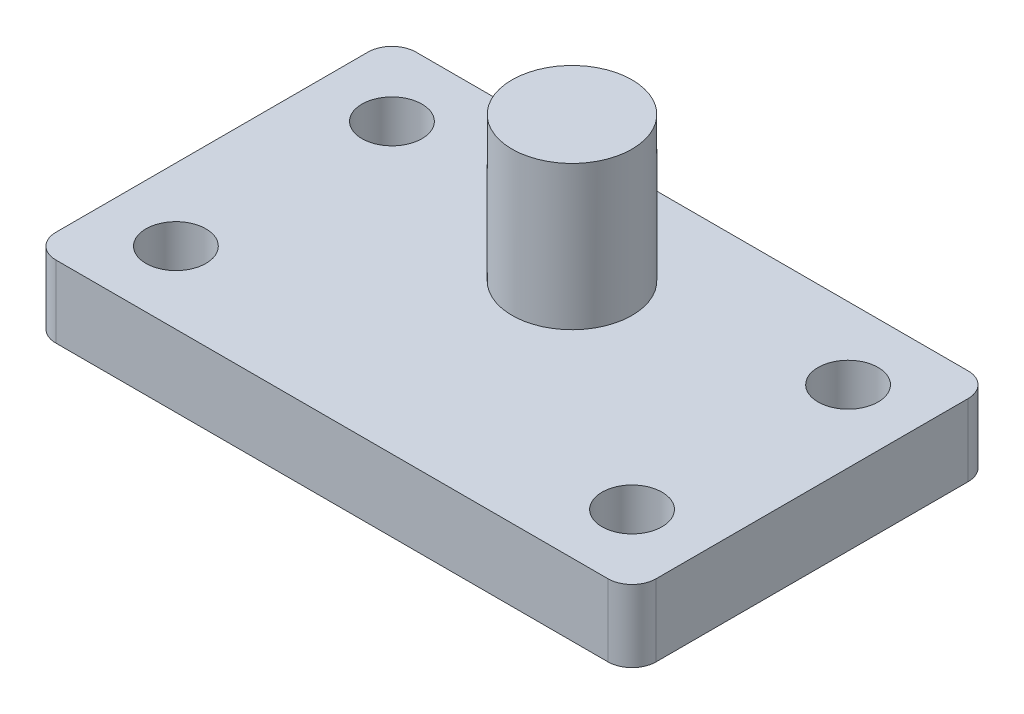
ISO-10303-21;
HEADER;
FILE_DESCRIPTION(('STEP AP214'),'2;1');
FILE_NAME('part.step','',(''),(''),'','','');
FILE_SCHEMA(('AUTOMOTIVE_DESIGN { 1 0 10303 214 1 1 1 1 }'));
ENDSEC;
DATA;
#1=APPLICATION_CONTEXT('core data for automotive mechanical design processes');
#2=APPLICATION_PROTOCOL_DEFINITION('international standard','automotive_design',2000,#1);
#3=PRODUCT_CONTEXT('',#1,'mechanical');
#4=PRODUCT('Part','Part','',(#3));
#5=PRODUCT_RELATED_PRODUCT_CATEGORY('part','',(#4));
#6=PRODUCT_DEFINITION_FORMATION('','',#4);
#7=PRODUCT_DEFINITION_CONTEXT('part definition',#1,'design');
#8=PRODUCT_DEFINITION('design','',#6,#7);
#9=PRODUCT_DEFINITION_SHAPE('','',#8);
#10=(LENGTH_UNIT() NAMED_UNIT(*) SI_UNIT(.MILLI.,.METRE.));
#11=(NAMED_UNIT(*) PLANE_ANGLE_UNIT() SI_UNIT($,.RADIAN.));
#12=(NAMED_UNIT(*) SI_UNIT($,.STERADIAN.) SOLID_ANGLE_UNIT());
#13=UNCERTAINTY_MEASURE_WITH_UNIT(LENGTH_MEASURE(1.E-05),#10,'distance_accuracy_value','');
#14=(GEOMETRIC_REPRESENTATION_CONTEXT(3) GLOBAL_UNCERTAINTY_ASSIGNED_CONTEXT((#13)) GLOBAL_UNIT_ASSIGNED_CONTEXT((#10,
#11,#12)) REPRESENTATION_CONTEXT('',''));
#15=CARTESIAN_POINT('',(0.,0.,0.));
#16=DIRECTION('',(0.,0.,1.));
#17=DIRECTION('',(1.,0.,0.));
#18=AXIS2_PLACEMENT_3D('',#15,#16,#17);
#19=CARTESIAN_POINT('',(115.,-30.,-65.));
#20=DIRECTION('',(0.,1.,0.));
#21=DIRECTION('',(0.,0.,1.));
#22=AXIS2_PLACEMENT_3D('',#19,#20,#21);
#23=CYLINDRICAL_SURFACE('',#22,9.99999999999999);
#24=CARTESIAN_POINT('',(115.,0.,-65.));
#25=DIRECTION('',(0.,1.,0.));
#26=DIRECTION('',(0.,0.,-1.));
#27=AXIS2_PLACEMENT_3D('',#24,#25,#26);
#28=CIRCLE('',#27,9.99999999999999);
#29=CARTESIAN_POINT('',(125.,0.,-65.));
#30=VERTEX_POINT('',#29);
#31=CARTESIAN_POINT('',(115.,0.,-75.));
#32=VERTEX_POINT('',#31);
#33=EDGE_CURVE('E149',#30,#32,#28,.T.);
#34=ORIENTED_EDGE('',*,*,#33,.F.);
#35=DIRECTION('',(0.,1.,0.));
#36=VECTOR('',#35,1.);
#37=CARTESIAN_POINT('',(125.,-30.,-65.));
#38=LINE('',#37,#36);
#39=CARTESIAN_POINT('',(125.,-30.,-65.));
#40=VERTEX_POINT('',#39);
#41=EDGE_CURVE('E54',#40,#30,#38,.T.);
#42=ORIENTED_EDGE('',*,*,#41,.F.);
#43=CARTESIAN_POINT('',(115.,-30.,-65.));
#44=DIRECTION('',(0.,1.,0.));
#45=DIRECTION('',(0.,0.,-1.));
#46=AXIS2_PLACEMENT_3D('',#43,#44,#45);
#47=CIRCLE('',#46,9.99999999999999);
#48=CARTESIAN_POINT('',(115.,-30.,-75.));
#49=VERTEX_POINT('',#48);
#50=EDGE_CURVE('E179',#40,#49,#47,.T.);
#51=ORIENTED_EDGE('',*,*,#50,.T.);
#52=DIRECTION('',(0.,1.,0.));
#53=VECTOR('',#52,1.);
#54=CARTESIAN_POINT('',(115.,-30.,-75.));
#55=LINE('',#54,#53);
#56=EDGE_CURVE('E102',#49,#32,#55,.T.);
#57=ORIENTED_EDGE('',*,*,#56,.T.);
#58=EDGE_LOOP('',(#34,#42,#51,#57));
#59=FACE_BOUND('',#58,.T.);
#60=ADVANCED_FACE('F45',(#59),#23,.T.);
#61=CARTESIAN_POINT('',(125.,-30.,-65.));
#62=DIRECTION('',(1.,0.,0.));
#63=DIRECTION('',(0.,0.,-1.));
#64=AXIS2_PLACEMENT_3D('',#61,#62,#63);
#65=PLANE('',#64);
#66=DIRECTION('',(0.,0.,-1.));
#67=VECTOR('',#66,1.);
#68=CARTESIAN_POINT('',(125.,0.,-65.));
#69=LINE('',#68,#67);
#70=CARTESIAN_POINT('',(125.,0.,65.));
#71=VERTEX_POINT('',#70);
#72=EDGE_CURVE('E175',#71,#30,#69,.T.);
#73=ORIENTED_EDGE('',*,*,#72,.F.);
#74=DIRECTION('',(0.,1.,0.));
#75=VECTOR('',#74,1.);
#76=CARTESIAN_POINT('',(125.,-30.,65.));
#77=LINE('',#76,#75);
#78=CARTESIAN_POINT('',(125.,-30.,65.));
#79=VERTEX_POINT('',#78);
#80=EDGE_CURVE('E90',#79,#71,#77,.T.);
#81=ORIENTED_EDGE('',*,*,#80,.F.);
#82=DIRECTION('',(0.,0.,-1.));
#83=VECTOR('',#82,1.);
#84=CARTESIAN_POINT('',(125.,-30.,-65.));
#85=LINE('',#84,#83);
#86=EDGE_CURVE('E135',#79,#40,#85,.T.);
#87=ORIENTED_EDGE('',*,*,#86,.T.);
#88=ORIENTED_EDGE('',*,*,#41,.T.);
#89=EDGE_LOOP('',(#73,#81,#87,#88));
#90=FACE_BOUND('',#89,.T.);
#91=ADVANCED_FACE('F199',(#90),#65,.T.);
#92=CARTESIAN_POINT('',(115.,-30.,65.));
#93=DIRECTION('',(0.,1.,0.));
#94=DIRECTION('',(0.,0.,1.));
#95=AXIS2_PLACEMENT_3D('',#92,#93,#94);
#96=CYLINDRICAL_SURFACE('',#95,9.99999999999999);
#97=CARTESIAN_POINT('',(115.,0.,65.));
#98=DIRECTION('',(0.,1.,0.));
#99=DIRECTION('',(0.,0.,1.));
#100=AXIS2_PLACEMENT_3D('',#97,#98,#99);
#101=CIRCLE('',#100,9.99999999999999);
#102=CARTESIAN_POINT('',(115.,0.,75.));
#103=VERTEX_POINT('',#102);
#104=EDGE_CURVE('E121',#103,#71,#101,.T.);
#105=ORIENTED_EDGE('',*,*,#104,.F.);
#106=DIRECTION('',(0.,1.,0.));
#107=VECTOR('',#106,1.);
#108=CARTESIAN_POINT('',(115.,-30.,75.));
#109=LINE('',#108,#107);
#110=CARTESIAN_POINT('',(115.,-30.,75.));
#111=VERTEX_POINT('',#110);
#112=EDGE_CURVE('E116',#111,#103,#109,.T.);
#113=ORIENTED_EDGE('',*,*,#112,.F.);
#114=CARTESIAN_POINT('',(115.,-30.,65.));
#115=DIRECTION('',(0.,1.,0.));
#116=DIRECTION('',(0.,0.,1.));
#117=AXIS2_PLACEMENT_3D('',#114,#115,#116);
#118=CIRCLE('',#117,9.99999999999999);
#119=EDGE_CURVE('E119',#111,#79,#118,.T.);
#120=ORIENTED_EDGE('',*,*,#119,.T.);
#121=ORIENTED_EDGE('',*,*,#80,.T.);
#122=EDGE_LOOP('',(#105,#113,#120,#121));
#123=FACE_BOUND('',#122,.T.);
#124=ADVANCED_FACE('F118',(#123),#96,.T.);
#125=CARTESIAN_POINT('',(-115.,-30.,75.));
#126=DIRECTION('',(0.,0.,1.));
#127=DIRECTION('',(1.,0.,0.));
#128=AXIS2_PLACEMENT_3D('',#125,#126,#127);
#129=PLANE('',#128);
#130=DIRECTION('',(1.,0.,0.));
#131=VECTOR('',#130,1.);
#132=CARTESIAN_POINT('',(-115.,0.,75.));
#133=LINE('',#132,#131);
#134=CARTESIAN_POINT('',(-115.,0.,75.));
#135=VERTEX_POINT('',#134);
#136=EDGE_CURVE('E170',#135,#103,#133,.T.);
#137=ORIENTED_EDGE('',*,*,#136,.F.);
#138=DIRECTION('',(0.,1.,0.));
#139=VECTOR('',#138,1.);
#140=CARTESIAN_POINT('',(-115.,-30.,75.));
#141=LINE('',#140,#139);
#142=CARTESIAN_POINT('',(-115.,-30.,75.));
#143=VERTEX_POINT('',#142);
#144=EDGE_CURVE('E127',#143,#135,#141,.T.);
#145=ORIENTED_EDGE('',*,*,#144,.F.);
#146=DIRECTION('',(1.,0.,0.));
#147=VECTOR('',#146,1.);
#148=CARTESIAN_POINT('',(-115.,-30.,75.));
#149=LINE('',#148,#147);
#150=EDGE_CURVE('E133',#143,#111,#149,.T.);
#151=ORIENTED_EDGE('',*,*,#150,.T.);
#152=ORIENTED_EDGE('',*,*,#112,.T.);
#153=EDGE_LOOP('',(#137,#145,#151,#152));
#154=FACE_BOUND('',#153,.T.);
#155=ADVANCED_FACE('F138',(#154),#129,.T.);
#156=CARTESIAN_POINT('',(-115.,-30.,65.));
#157=DIRECTION('',(0.,1.,0.));
#158=DIRECTION('',(0.,0.,1.));
#159=AXIS2_PLACEMENT_3D('',#156,#157,#158);
#160=CYLINDRICAL_SURFACE('',#159,10.);
#161=CARTESIAN_POINT('',(-115.,0.,65.));
#162=DIRECTION('',(0.,1.,0.));
#163=DIRECTION('',(0.,0.,1.));
#164=AXIS2_PLACEMENT_3D('',#161,#162,#163);
#165=CIRCLE('',#164,10.);
#166=CARTESIAN_POINT('',(-125.,0.,65.));
#167=VERTEX_POINT('',#166);
#168=EDGE_CURVE('E166',#167,#135,#165,.T.);
#169=ORIENTED_EDGE('',*,*,#168,.F.);
#170=DIRECTION('',(0.,1.,0.));
#171=VECTOR('',#170,1.);
#172=CARTESIAN_POINT('',(-125.,-30.,65.));
#173=LINE('',#172,#171);
#174=CARTESIAN_POINT('',(-125.,-30.,65.));
#175=VERTEX_POINT('',#174);
#176=EDGE_CURVE('E186',#175,#167,#173,.T.);
#177=ORIENTED_EDGE('',*,*,#176,.F.);
#178=CARTESIAN_POINT('',(-115.,-30.,65.));
#179=DIRECTION('',(0.,1.,0.));
#180=DIRECTION('',(0.,0.,1.));
#181=AXIS2_PLACEMENT_3D('',#178,#179,#180);
#182=CIRCLE('',#181,10.);
#183=EDGE_CURVE('E140',#175,#143,#182,.T.);
#184=ORIENTED_EDGE('',*,*,#183,.T.);
#185=ORIENTED_EDGE('',*,*,#144,.T.);
#186=EDGE_LOOP('',(#169,#177,#184,#185));
#187=FACE_BOUND('',#186,.T.);
#188=ADVANCED_FACE('F212',(#187),#160,.T.);
#189=CARTESIAN_POINT('',(-125.,-30.,-65.));
#190=DIRECTION('',(-1.,0.,0.));
#191=DIRECTION('',(0.,0.,1.));
#192=AXIS2_PLACEMENT_3D('',#189,#190,#191);
#193=PLANE('',#192);
#194=DIRECTION('',(0.,0.,1.));
#195=VECTOR('',#194,1.);
#196=CARTESIAN_POINT('',(-125.,0.,-65.));
#197=LINE('',#196,#195);
#198=CARTESIAN_POINT('',(-125.,0.,-65.));
#199=VERTEX_POINT('',#198);
#200=EDGE_CURVE('E162',#199,#167,#197,.T.);
#201=ORIENTED_EDGE('',*,*,#200,.F.);
#202=DIRECTION('',(0.,1.,0.));
#203=VECTOR('',#202,1.);
#204=CARTESIAN_POINT('',(-125.,-30.,-65.));
#205=LINE('',#204,#203);
#206=CARTESIAN_POINT('',(-125.,-30.,-65.));
#207=VERTEX_POINT('',#206);
#208=EDGE_CURVE('E189',#207,#199,#205,.T.);
#209=ORIENTED_EDGE('',*,*,#208,.F.);
#210=DIRECTION('',(0.,0.,1.));
#211=VECTOR('',#210,1.);
#212=CARTESIAN_POINT('',(-125.,-30.,-65.));
#213=LINE('',#212,#211);
#214=EDGE_CURVE('E143',#207,#175,#213,.T.);
#215=ORIENTED_EDGE('',*,*,#214,.T.);
#216=ORIENTED_EDGE('',*,*,#176,.T.);
#217=EDGE_LOOP('',(#201,#209,#215,#216));
#218=FACE_BOUND('',#217,.T.);
#219=ADVANCED_FACE('F215',(#218),#193,.T.);
#220=CARTESIAN_POINT('',(-115.,-30.,-65.));
#221=DIRECTION('',(0.,1.,0.));
#222=DIRECTION('',(0.,0.,1.));
#223=AXIS2_PLACEMENT_3D('',#220,#221,#222);
#224=CYLINDRICAL_SURFACE('',#223,9.99999999999999);
#225=CARTESIAN_POINT('',(-115.,0.,-65.));
#226=DIRECTION('',(0.,1.,0.));
#227=DIRECTION('',(0.,0.,1.));
#228=AXIS2_PLACEMENT_3D('',#225,#226,#227);
#229=CIRCLE('',#228,9.99999999999999);
#230=CARTESIAN_POINT('',(-115.,0.,-75.));
#231=VERTEX_POINT('',#230);
#232=EDGE_CURVE('E158',#231,#199,#229,.T.);
#233=ORIENTED_EDGE('',*,*,#232,.F.);
#234=DIRECTION('',(0.,1.,0.));
#235=VECTOR('',#234,1.);
#236=CARTESIAN_POINT('',(-115.,-30.,-75.));
#237=LINE('',#236,#235);
#238=CARTESIAN_POINT('',(-115.,-30.,-75.));
#239=VERTEX_POINT('',#238);
#240=EDGE_CURVE('E192',#239,#231,#237,.T.);
#241=ORIENTED_EDGE('',*,*,#240,.F.);
#242=CARTESIAN_POINT('',(-115.,-30.,-65.));
#243=DIRECTION('',(0.,1.,0.));
#244=DIRECTION('',(0.,0.,1.));
#245=AXIS2_PLACEMENT_3D('',#242,#243,#244);
#246=CIRCLE('',#245,9.99999999999999);
#247=EDGE_CURVE('E303',#239,#207,#246,.T.);
#248=ORIENTED_EDGE('',*,*,#247,.T.);
#249=ORIENTED_EDGE('',*,*,#208,.T.);
#250=EDGE_LOOP('',(#233,#241,#248,#249));
#251=FACE_BOUND('',#250,.T.);
#252=ADVANCED_FACE('F219',(#251),#224,.T.);
#253=CARTESIAN_POINT('',(-115.,-30.,-75.));
#254=DIRECTION('',(0.,0.,-1.));
#255=DIRECTION('',(-1.,0.,0.));
#256=AXIS2_PLACEMENT_3D('',#253,#254,#255);
#257=PLANE('',#256);
#258=DIRECTION('',(-1.,0.,0.));
#259=VECTOR('',#258,1.);
#260=CARTESIAN_POINT('',(-115.,0.,-75.));
#261=LINE('',#260,#259);
#262=EDGE_CURVE('E153',#32,#231,#261,.T.);
#263=ORIENTED_EDGE('',*,*,#262,.F.);
#264=ORIENTED_EDGE('',*,*,#56,.F.);
#265=DIRECTION('',(-1.,0.,0.));
#266=VECTOR('',#265,1.);
#267=CARTESIAN_POINT('',(-115.,-30.,-75.));
#268=LINE('',#267,#266);
#269=EDGE_CURVE('E300',#49,#239,#268,.T.);
#270=ORIENTED_EDGE('',*,*,#269,.T.);
#271=ORIENTED_EDGE('',*,*,#240,.T.);
#272=EDGE_LOOP('',(#263,#264,#270,#271));
#273=FACE_BOUND('',#272,.T.);
#274=ADVANCED_FACE('F195',(#273),#257,.T.);
#275=CARTESIAN_POINT('',(115.,-30.,-65.));
#276=DIRECTION('',(0.,-1.,0.));
#277=DIRECTION('',(0.,0.,-1.));
#278=AXIS2_PLACEMENT_3D('',#275,#276,#277);
#279=PLANE('',#278);
#280=CARTESIAN_POINT('',(94.9999999999999,-30.,45.));
#281=DIRECTION('',(0.,1.,0.));
#282=DIRECTION('',(0.,0.,1.));
#283=AXIS2_PLACEMENT_3D('',#280,#281,#282);
#284=CIRCLE('',#283,12.5);
#285=CARTESIAN_POINT('',(94.9999999999999,-30.,57.5));
#286=VERTEX_POINT('',#285);
#287=EDGE_CURVE('E262',#286,#286,#284,.T.);
#288=ORIENTED_EDGE('',*,*,#287,.T.);
#289=EDGE_LOOP('',(#288));
#290=FACE_BOUND('',#289,.T.);
#291=CARTESIAN_POINT('',(-95.0000000000001,-30.,45.));
#292=DIRECTION('',(0.,1.,0.));
#293=DIRECTION('',(0.,0.,1.));
#294=AXIS2_PLACEMENT_3D('',#291,#292,#293);
#295=CIRCLE('',#294,12.5);
#296=CARTESIAN_POINT('',(-95.0000000000001,-30.,57.5));
#297=VERTEX_POINT('',#296);
#298=EDGE_CURVE('E267',#297,#297,#295,.T.);
#299=ORIENTED_EDGE('',*,*,#298,.T.);
#300=EDGE_LOOP('',(#299));
#301=FACE_BOUND('',#300,.T.);
#302=CARTESIAN_POINT('',(94.9999999999999,-30.,-45.));
#303=DIRECTION('',(0.,1.,0.));
#304=DIRECTION('',(0.,0.,1.));
#305=AXIS2_PLACEMENT_3D('',#302,#303,#304);
#306=CIRCLE('',#305,12.5);
#307=CARTESIAN_POINT('',(94.9999999999999,-30.,-32.5));
#308=VERTEX_POINT('',#307);
#309=EDGE_CURVE('E279',#308,#308,#306,.T.);
#310=ORIENTED_EDGE('',*,*,#309,.T.);
#311=EDGE_LOOP('',(#310));
#312=FACE_BOUND('',#311,.T.);
#313=CARTESIAN_POINT('',(-95.0000000000001,-30.,-45.));
#314=DIRECTION('',(0.,1.,0.));
#315=DIRECTION('',(0.,0.,1.));
#316=AXIS2_PLACEMENT_3D('',#313,#314,#315);
#317=CIRCLE('',#316,12.5);
#318=CARTESIAN_POINT('',(-95.0000000000001,-30.,-32.5));
#319=VERTEX_POINT('',#318);
#320=EDGE_CURVE('E288',#319,#319,#317,.T.);
#321=ORIENTED_EDGE('',*,*,#320,.T.);
#322=EDGE_LOOP('',(#321));
#323=FACE_BOUND('',#322,.T.);
#324=ORIENTED_EDGE('',*,*,#50,.F.);
#325=ORIENTED_EDGE('',*,*,#86,.F.);
#326=ORIENTED_EDGE('',*,*,#119,.F.);
#327=ORIENTED_EDGE('',*,*,#150,.F.);
#328=ORIENTED_EDGE('',*,*,#183,.F.);
#329=ORIENTED_EDGE('',*,*,#214,.F.);
#330=ORIENTED_EDGE('',*,*,#247,.F.);
#331=ORIENTED_EDGE('',*,*,#269,.F.);
#332=EDGE_LOOP('',(#324,#325,#326,#327,#328,#329,#330,#331));
#333=FACE_BOUND('',#332,.T.);
#334=ADVANCED_FACE('F131',(#290,#301,#312,#323,#333),#279,.T.);
#335=CARTESIAN_POINT('',(115.,0.,-65.));
#336=DIRECTION('',(0.,-1.,0.));
#337=DIRECTION('',(0.,0.,-1.));
#338=AXIS2_PLACEMENT_3D('',#335,#336,#337);
#339=PLANE('',#338);
#340=CARTESIAN_POINT('',(94.9999999999999,0.,45.));
#341=DIRECTION('',(0.,1.,0.));
#342=DIRECTION('',(0.,0.,1.));
#343=AXIS2_PLACEMENT_3D('',#340,#341,#342);
#344=CIRCLE('',#343,12.5);
#345=CARTESIAN_POINT('',(94.9999999999999,0.,57.5));
#346=VERTEX_POINT('',#345);
#347=EDGE_CURVE('E265',#346,#346,#344,.T.);
#348=ORIENTED_EDGE('',*,*,#347,.F.);
#349=EDGE_LOOP('',(#348));
#350=FACE_BOUND('',#349,.T.);
#351=CARTESIAN_POINT('',(-95.0000000000001,0.,45.));
#352=DIRECTION('',(0.,1.,0.));
#353=DIRECTION('',(0.,0.,1.));
#354=AXIS2_PLACEMENT_3D('',#351,#352,#353);
#355=CIRCLE('',#354,12.5);
#356=CARTESIAN_POINT('',(-95.0000000000001,0.,57.5));
#357=VERTEX_POINT('',#356);
#358=EDGE_CURVE('E272',#357,#357,#355,.T.);
#359=ORIENTED_EDGE('',*,*,#358,.F.);
#360=EDGE_LOOP('',(#359));
#361=FACE_BOUND('',#360,.T.);
#362=CARTESIAN_POINT('',(94.9999999999999,0.,-45.));
#363=DIRECTION('',(0.,1.,0.));
#364=DIRECTION('',(0.,0.,1.));
#365=AXIS2_PLACEMENT_3D('',#362,#363,#364);
#366=CIRCLE('',#365,12.5);
#367=CARTESIAN_POINT('',(94.9999999999999,0.,-32.5));
#368=VERTEX_POINT('',#367);
#369=EDGE_CURVE('E283',#368,#368,#366,.T.);
#370=ORIENTED_EDGE('',*,*,#369,.F.);
#371=EDGE_LOOP('',(#370));
#372=FACE_BOUND('',#371,.T.);
#373=CARTESIAN_POINT('',(-95.0000000000001,0.,-45.));
#374=DIRECTION('',(0.,1.,0.));
#375=DIRECTION('',(0.,0.,1.));
#376=AXIS2_PLACEMENT_3D('',#373,#374,#375);
#377=CIRCLE('',#376,12.5);
#378=CARTESIAN_POINT('',(-95.0000000000001,0.,-32.5));
#379=VERTEX_POINT('',#378);
#380=EDGE_CURVE('E287',#379,#379,#377,.T.);
#381=ORIENTED_EDGE('',*,*,#380,.F.);
#382=EDGE_LOOP('',(#381));
#383=FACE_BOUND('',#382,.T.);
#384=CARTESIAN_POINT('',(0.,0.,-25.));
#385=DIRECTION('',(0.,-1.,0.));
#386=DIRECTION('',(0.,0.,-1.));
#387=AXIS2_PLACEMENT_3D('',#384,#385,#386);
#388=CIRCLE('',#387,25.);
#389=CARTESIAN_POINT('',(0.,0.,-50.));
#390=VERTEX_POINT('',#389);
#391=EDGE_CURVE('E11',#390,#390,#388,.F.);
#392=ORIENTED_EDGE('',*,*,#391,.F.);
#393=EDGE_LOOP('',(#392));
#394=FACE_BOUND('',#393,.T.);
#395=ORIENTED_EDGE('',*,*,#33,.T.);
#396=ORIENTED_EDGE('',*,*,#262,.T.);
#397=ORIENTED_EDGE('',*,*,#232,.T.);
#398=ORIENTED_EDGE('',*,*,#200,.T.);
#399=ORIENTED_EDGE('',*,*,#168,.T.);
#400=ORIENTED_EDGE('',*,*,#136,.T.);
#401=ORIENTED_EDGE('',*,*,#104,.T.);
#402=ORIENTED_EDGE('',*,*,#72,.T.);
#403=EDGE_LOOP('',(#395,#396,#397,#398,#399,#400,#401,#402));
#404=FACE_BOUND('',#403,.T.);
#405=ADVANCED_FACE('F198',(#350,#361,#372,#383,#394,#404),#339,.F.);
#406=CARTESIAN_POINT('',(0.,60.,-25.));
#407=DIRECTION('',(0.,-1.,0.));
#408=DIRECTION('',(0.,0.,-1.));
#409=AXIS2_PLACEMENT_3D('',#406,#407,#408);
#410=CYLINDRICAL_SURFACE('',#409,25.);
#411=CARTESIAN_POINT('',(0.,60.,-25.));
#412=DIRECTION('',(0.,1.,0.));
#413=DIRECTION('',(0.,0.,1.));
#414=AXIS2_PLACEMENT_3D('',#411,#412,#413);
#415=CIRCLE('',#414,25.);
#416=CARTESIAN_POINT('',(0.,60.,0.));
#417=VERTEX_POINT('',#416);
#418=EDGE_CURVE('E154',#417,#417,#415,.T.);
#419=ORIENTED_EDGE('',*,*,#418,.F.);
#420=EDGE_LOOP('',(#419));
#421=FACE_BOUND('',#420,.T.);
#422=ORIENTED_EDGE('',*,*,#391,.T.);
#423=EDGE_LOOP('',(#422));
#424=FACE_BOUND('',#423,.T.);
#425=ADVANCED_FACE('F233',(#421,#424),#410,.T.);
#426=CARTESIAN_POINT('',(0.,60.,-25.));
#427=DIRECTION('',(0.,1.,0.));
#428=DIRECTION('',(0.,0.,1.));
#429=AXIS2_PLACEMENT_3D('',#426,#427,#428);
#430=PLANE('',#429);
#431=ORIENTED_EDGE('',*,*,#418,.T.);
#432=EDGE_LOOP('',(#431));
#433=FACE_BOUND('',#432,.T.);
#434=ADVANCED_FACE('F239',(#433),#430,.T.);
#435=CARTESIAN_POINT('',(-95.0000000000001,-30.,-45.));
#436=DIRECTION('',(0.,1.,0.));
#437=DIRECTION('',(0.,0.,1.));
#438=AXIS2_PLACEMENT_3D('',#435,#436,#437);
#439=CYLINDRICAL_SURFACE('',#438,12.5);
#440=ORIENTED_EDGE('',*,*,#320,.F.);
#441=EDGE_LOOP('',(#440));
#442=FACE_BOUND('',#441,.T.);
#443=ORIENTED_EDGE('',*,*,#380,.T.);
#444=EDGE_LOOP('',(#443));
#445=FACE_BOUND('',#444,.T.);
#446=ADVANCED_FACE('F243',(#442,#445),#439,.F.);
#447=CARTESIAN_POINT('',(94.9999999999999,-30.,-45.));
#448=DIRECTION('',(0.,1.,0.));
#449=DIRECTION('',(0.,0.,1.));
#450=AXIS2_PLACEMENT_3D('',#447,#448,#449);
#451=CYLINDRICAL_SURFACE('',#450,12.5);
#452=ORIENTED_EDGE('',*,*,#309,.F.);
#453=EDGE_LOOP('',(#452));
#454=FACE_BOUND('',#453,.T.);
#455=ORIENTED_EDGE('',*,*,#369,.T.);
#456=EDGE_LOOP('',(#455));
#457=FACE_BOUND('',#456,.T.);
#458=ADVANCED_FACE('F246',(#454,#457),#451,.F.);
#459=CARTESIAN_POINT('',(-95.0000000000001,-30.,45.));
#460=DIRECTION('',(0.,1.,0.));
#461=DIRECTION('',(0.,0.,1.));
#462=AXIS2_PLACEMENT_3D('',#459,#460,#461);
#463=CYLINDRICAL_SURFACE('',#462,12.5);
#464=ORIENTED_EDGE('',*,*,#298,.F.);
#465=EDGE_LOOP('',(#464));
#466=FACE_BOUND('',#465,.T.);
#467=ORIENTED_EDGE('',*,*,#358,.T.);
#468=EDGE_LOOP('',(#467));
#469=FACE_BOUND('',#468,.T.);
#470=ADVANCED_FACE('F250',(#466,#469),#463,.F.);
#471=CARTESIAN_POINT('',(94.9999999999999,-30.,45.));
#472=DIRECTION('',(0.,1.,0.));
#473=DIRECTION('',(0.,0.,1.));
#474=AXIS2_PLACEMENT_3D('',#471,#472,#473);
#475=CYLINDRICAL_SURFACE('',#474,12.5);
#476=ORIENTED_EDGE('',*,*,#287,.F.);
#477=EDGE_LOOP('',(#476));
#478=FACE_BOUND('',#477,.T.);
#479=ORIENTED_EDGE('',*,*,#347,.T.);
#480=EDGE_LOOP('',(#479));
#481=FACE_BOUND('',#480,.T.);
#482=ADVANCED_FACE('F254',(#478,#481),#475,.F.);
#483=CLOSED_SHELL('',(#60,#91,#124,#155,#188,#219,#252,#274,#334,#405,#425,#434,#446,#458,#470,#482));
#484=MANIFOLD_SOLID_BREP('B2',#483);
#485=ADVANCED_BREP_SHAPE_REPRESENTATION('',(#18,#484),#14);
#486=SHAPE_DEFINITION_REPRESENTATION(#9,#485);
ENDSEC;
END-ISO-10303-21;
